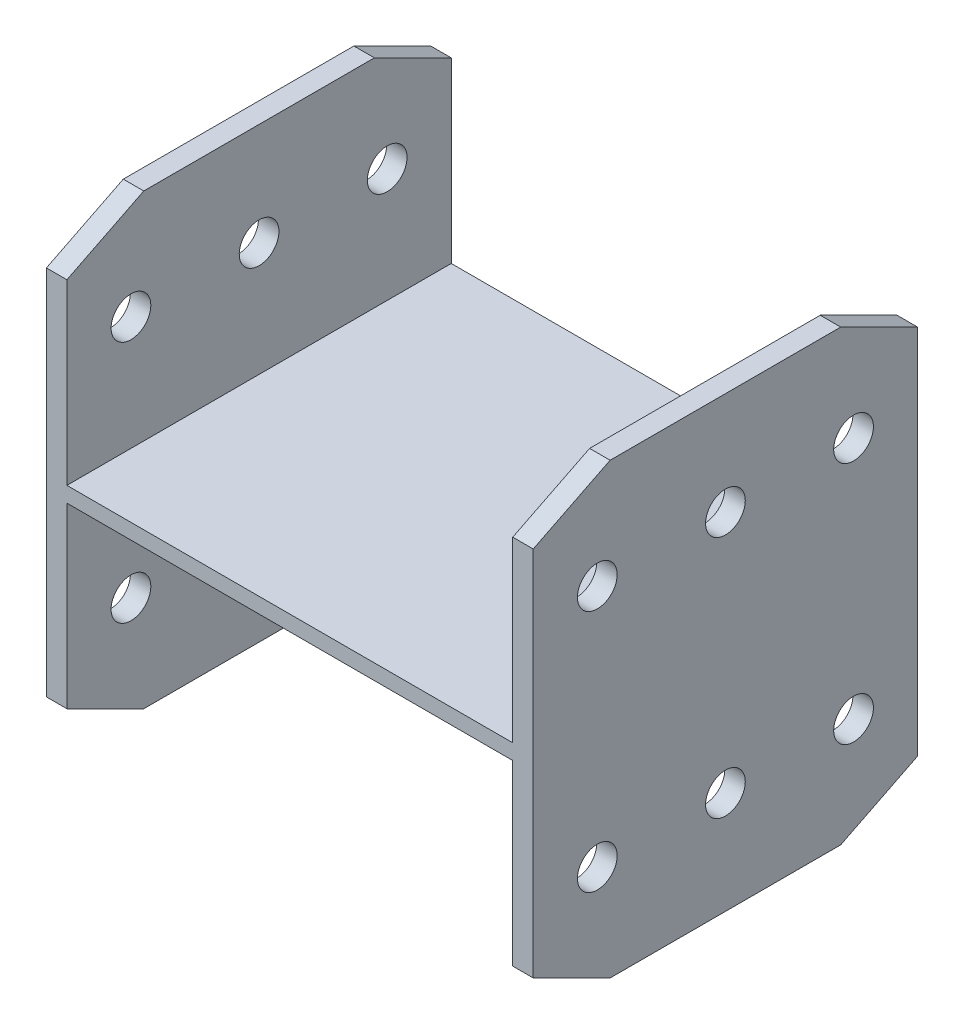
ISO-10303-21;
HEADER;
FILE_DESCRIPTION(('STEP AP214'),'2;1');
FILE_NAME('part.step','',(''),(''),'','','');
FILE_SCHEMA(('AUTOMOTIVE_DESIGN { 1 0 10303 214 1 1 1 1 }'));
ENDSEC;
DATA;
#1=APPLICATION_CONTEXT('core data for automotive mechanical design processes');
#2=APPLICATION_PROTOCOL_DEFINITION('international standard','automotive_design',2000,#1);
#3=PRODUCT_CONTEXT('',#1,'mechanical');
#4=PRODUCT('Part','Part','',(#3));
#5=PRODUCT_RELATED_PRODUCT_CATEGORY('part','',(#4));
#6=PRODUCT_DEFINITION_FORMATION('','',#4);
#7=PRODUCT_DEFINITION_CONTEXT('part definition',#1,'design');
#8=PRODUCT_DEFINITION('design','',#6,#7);
#9=PRODUCT_DEFINITION_SHAPE('','',#8);
#10=(LENGTH_UNIT() NAMED_UNIT(*) SI_UNIT(.MILLI.,.METRE.));
#11=(NAMED_UNIT(*) PLANE_ANGLE_UNIT() SI_UNIT($,.RADIAN.));
#12=(NAMED_UNIT(*) SI_UNIT($,.STERADIAN.) SOLID_ANGLE_UNIT());
#13=UNCERTAINTY_MEASURE_WITH_UNIT(LENGTH_MEASURE(1.E-05),#10,'distance_accuracy_value','');
#14=(GEOMETRIC_REPRESENTATION_CONTEXT(3) GLOBAL_UNCERTAINTY_ASSIGNED_CONTEXT((#13)) GLOBAL_UNIT_ASSIGNED_CONTEXT((#10,
#11,#12)) REPRESENTATION_CONTEXT('',''));
#15=CARTESIAN_POINT('',(0.,0.,0.));
#16=DIRECTION('',(0.,0.,1.));
#17=DIRECTION('',(1.,0.,0.));
#18=AXIS2_PLACEMENT_3D('',#15,#16,#17);
#19=CARTESIAN_POINT('',(-174.,-5.99999999999997,150.));
#20=DIRECTION('',(-1.,0.,0.));
#21=DIRECTION('',(0.,-1.,0.));
#22=AXIS2_PLACEMENT_3D('',#19,#20,#21);
#23=PLANE('',#22);
#24=CARTESIAN_POINT('',(-174.,-95.,100.));
#25=DIRECTION('',(-1.,0.,0.));
#26=DIRECTION('',(0.,-1.,0.));
#27=AXIS2_PLACEMENT_3D('',#24,#25,#26);
#28=CIRCLE('',#27,15.5);
#29=CARTESIAN_POINT('',(-174.,-110.5,100.));
#30=VERTEX_POINT('',#29);
#31=EDGE_CURVE('E313',#30,#30,#28,.T.);
#32=ORIENTED_EDGE('',*,*,#31,.T.);
#33=EDGE_LOOP('',(#32));
#34=FACE_BOUND('',#33,.T.);
#35=CARTESIAN_POINT('',(-174.,-95.,0.));
#36=DIRECTION('',(-1.,0.,0.));
#37=DIRECTION('',(0.,-1.,0.));
#38=AXIS2_PLACEMENT_3D('',#35,#36,#37);
#39=CIRCLE('',#38,15.5);
#40=CARTESIAN_POINT('',(-174.,-110.5,0.));
#41=VERTEX_POINT('',#40);
#42=EDGE_CURVE('E325',#41,#41,#39,.T.);
#43=ORIENTED_EDGE('',*,*,#42,.T.);
#44=EDGE_LOOP('',(#43));
#45=FACE_BOUND('',#44,.T.);
#46=CARTESIAN_POINT('',(-174.,-95.,-100.));
#47=DIRECTION('',(-1.,0.,0.));
#48=DIRECTION('',(0.,-1.,0.));
#49=AXIS2_PLACEMENT_3D('',#46,#47,#48);
#50=CIRCLE('',#49,15.5);
#51=CARTESIAN_POINT('',(-174.,-110.5,-100.));
#52=VERTEX_POINT('',#51);
#53=EDGE_CURVE('E361',#52,#52,#50,.T.);
#54=ORIENTED_EDGE('',*,*,#53,.T.);
#55=EDGE_LOOP('',(#54));
#56=FACE_BOUND('',#55,.T.);
#57=DIRECTION('',(0.,1.,0.));
#58=VECTOR('',#57,1.);
#59=CARTESIAN_POINT('',(-174.,-5.99999999999997,150.));
#60=LINE('',#59,#58);
#61=CARTESIAN_POINT('',(-174.,-145.,150.));
#62=VERTEX_POINT('',#61);
#63=CARTESIAN_POINT('',(-174.,-5.99999999999997,150.));
#64=VERTEX_POINT('',#63);
#65=EDGE_CURVE('E243',#62,#64,#60,.T.);
#66=ORIENTED_EDGE('',*,*,#65,.F.);
#67=DIRECTION('',(0.,-0.447213595499958,-0.894427190999916));
#68=VECTOR('',#67,1.);
#69=CARTESIAN_POINT('',(-174.,-117.2,205.6));
#70=LINE('',#69,#68);
#71=CARTESIAN_POINT('',(-174.,-175.,90.));
#72=VERTEX_POINT('',#71);
#73=EDGE_CURVE('E46',#62,#72,#70,.T.);
#74=ORIENTED_EDGE('',*,*,#73,.T.);
#75=DIRECTION('',(0.,0.,-1.));
#76=VECTOR('',#75,1.);
#77=CARTESIAN_POINT('',(-174.,-175.,150.));
#78=LINE('',#77,#76);
#79=CARTESIAN_POINT('',(-174.,-175.,-90.));
#80=VERTEX_POINT('',#79);
#81=EDGE_CURVE('E244',#72,#80,#78,.T.);
#82=ORIENTED_EDGE('',*,*,#81,.T.);
#83=DIRECTION('',(0.,0.447213595499958,-0.894427190999916));
#84=VECTOR('',#83,1.);
#85=CARTESIAN_POINT('',(-174.,-237.2,34.4));
#86=LINE('',#85,#84);
#87=CARTESIAN_POINT('',(-174.,-145.,-150.));
#88=VERTEX_POINT('',#87);
#89=EDGE_CURVE('E409',#80,#88,#86,.T.);
#90=ORIENTED_EDGE('',*,*,#89,.T.);
#91=DIRECTION('',(0.,1.,0.));
#92=VECTOR('',#91,1.);
#93=CARTESIAN_POINT('',(-174.,-5.99999999999997,-150.));
#94=LINE('',#93,#92);
#95=CARTESIAN_POINT('',(-174.,-5.99999999999997,-150.));
#96=VERTEX_POINT('',#95);
#97=EDGE_CURVE('E376',#88,#96,#94,.T.);
#98=ORIENTED_EDGE('',*,*,#97,.T.);
#99=DIRECTION('',(0.,0.,-1.));
#100=VECTOR('',#99,1.);
#101=CARTESIAN_POINT('',(-174.,-5.99999999999997,150.));
#102=LINE('',#101,#100);
#103=EDGE_CURVE('E201',#64,#96,#102,.T.);
#104=ORIENTED_EDGE('',*,*,#103,.F.);
#105=EDGE_LOOP('',(#66,#74,#82,#90,#98,#104));
#106=FACE_BOUND('',#105,.T.);
#107=ADVANCED_FACE('F32',(#34,#45,#56,#106),#23,.F.);
#108=CARTESIAN_POINT('',(-174.,-5.99999999999997,150.));
#109=DIRECTION('',(0.,1.,0.));
#110=DIRECTION('',(0.,0.,1.));
#111=AXIS2_PLACEMENT_3D('',#108,#109,#110);
#112=PLANE('',#111);
#113=DIRECTION('',(1.,0.,0.));
#114=VECTOR('',#113,1.);
#115=CARTESIAN_POINT('',(-174.,-5.99999999999997,-150.));
#116=LINE('',#115,#114);
#117=CARTESIAN_POINT('',(174.,-5.99999999999997,-150.));
#118=VERTEX_POINT('',#117);
#119=EDGE_CURVE('E232',#96,#118,#116,.T.);
#120=ORIENTED_EDGE('',*,*,#119,.T.);
#121=DIRECTION('',(0.,0.,-1.));
#122=VECTOR('',#121,1.);
#123=CARTESIAN_POINT('',(174.,-5.99999999999997,150.));
#124=LINE('',#123,#122);
#125=CARTESIAN_POINT('',(174.,-5.99999999999997,150.));
#126=VERTEX_POINT('',#125);
#127=EDGE_CURVE('E192',#126,#118,#124,.T.);
#128=ORIENTED_EDGE('',*,*,#127,.F.);
#129=DIRECTION('',(1.,0.,0.));
#130=VECTOR('',#129,1.);
#131=CARTESIAN_POINT('',(-174.,-5.99999999999997,150.));
#132=LINE('',#131,#130);
#133=EDGE_CURVE('E378',#64,#126,#132,.T.);
#134=ORIENTED_EDGE('',*,*,#133,.F.);
#135=ORIENTED_EDGE('',*,*,#103,.T.);
#136=EDGE_LOOP('',(#120,#128,#134,#135));
#137=FACE_BOUND('',#136,.T.);
#138=ADVANCED_FACE('F396',(#137),#112,.F.);
#139=CARTESIAN_POINT('',(174.,-175.,150.));
#140=DIRECTION('',(1.,0.,0.));
#141=DIRECTION('',(0.,0.,-1.));
#142=AXIS2_PLACEMENT_3D('',#139,#140,#141);
#143=PLANE('',#142);
#144=CARTESIAN_POINT('',(174.,-95.,100.));
#145=DIRECTION('',(1.,0.,0.));
#146=DIRECTION('',(0.,0.,-1.));
#147=AXIS2_PLACEMENT_3D('',#144,#145,#146);
#148=CIRCLE('',#147,15.5);
#149=CARTESIAN_POINT('',(174.,-95.,84.5));
#150=VERTEX_POINT('',#149);
#151=EDGE_CURVE('E308',#150,#150,#148,.T.);
#152=ORIENTED_EDGE('',*,*,#151,.T.);
#153=EDGE_LOOP('',(#152));
#154=FACE_BOUND('',#153,.T.);
#155=CARTESIAN_POINT('',(174.,-95.,0.));
#156=DIRECTION('',(1.,0.,0.));
#157=DIRECTION('',(0.,0.,-1.));
#158=AXIS2_PLACEMENT_3D('',#155,#156,#157);
#159=CIRCLE('',#158,15.5);
#160=CARTESIAN_POINT('',(174.,-95.,-15.5));
#161=VERTEX_POINT('',#160);
#162=EDGE_CURVE('E320',#161,#161,#159,.T.);
#163=ORIENTED_EDGE('',*,*,#162,.T.);
#164=EDGE_LOOP('',(#163));
#165=FACE_BOUND('',#164,.T.);
#166=CARTESIAN_POINT('',(174.,-95.,-100.));
#167=DIRECTION('',(1.,0.,0.));
#168=DIRECTION('',(0.,0.,-1.));
#169=AXIS2_PLACEMENT_3D('',#166,#167,#168);
#170=CIRCLE('',#169,15.5);
#171=CARTESIAN_POINT('',(174.,-95.,-115.5));
#172=VERTEX_POINT('',#171);
#173=EDGE_CURVE('E356',#172,#172,#170,.T.);
#174=ORIENTED_EDGE('',*,*,#173,.T.);
#175=EDGE_LOOP('',(#174));
#176=FACE_BOUND('',#175,.T.);
#177=DIRECTION('',(0.,0.,-1.));
#178=VECTOR('',#177,1.);
#179=CARTESIAN_POINT('',(174.,-175.,150.));
#180=LINE('',#179,#178);
#181=CARTESIAN_POINT('',(174.,-175.,90.));
#182=VERTEX_POINT('',#181);
#183=CARTESIAN_POINT('',(174.,-175.,-90.));
#184=VERTEX_POINT('',#183);
#185=EDGE_CURVE('E189',#182,#184,#180,.T.);
#186=ORIENTED_EDGE('',*,*,#185,.F.);
#187=DIRECTION('',(0.,0.447213595499958,0.894427190999916));
#188=VECTOR('',#187,1.);
#189=CARTESIAN_POINT('',(174.,-151.,138.));
#190=LINE('',#189,#188);
#191=CARTESIAN_POINT('',(174.,-145.,150.));
#192=VERTEX_POINT('',#191);
#193=EDGE_CURVE('E168',#182,#192,#190,.T.);
#194=ORIENTED_EDGE('',*,*,#193,.T.);
#195=DIRECTION('',(0.,-1.,0.));
#196=VECTOR('',#195,1.);
#197=CARTESIAN_POINT('',(174.,-175.,150.));
#198=LINE('',#197,#196);
#199=EDGE_CURVE('E380',#126,#192,#198,.T.);
#200=ORIENTED_EDGE('',*,*,#199,.F.);
#201=ORIENTED_EDGE('',*,*,#127,.T.);
#202=DIRECTION('',(0.,-1.,0.));
#203=VECTOR('',#202,1.);
#204=CARTESIAN_POINT('',(174.,-175.,-150.));
#205=LINE('',#204,#203);
#206=CARTESIAN_POINT('',(174.,-145.,-150.));
#207=VERTEX_POINT('',#206);
#208=EDGE_CURVE('E228',#118,#207,#205,.T.);
#209=ORIENTED_EDGE('',*,*,#208,.T.);
#210=DIRECTION('',(0.,-0.447213595499958,0.894427190999916));
#211=VECTOR('',#210,1.);
#212=CARTESIAN_POINT('',(174.,-271.,102.));
#213=LINE('',#212,#211);
#214=EDGE_CURVE('E213',#207,#184,#213,.T.);
#215=ORIENTED_EDGE('',*,*,#214,.T.);
#216=EDGE_LOOP('',(#186,#194,#200,#201,#209,#215));
#217=FACE_BOUND('',#216,.T.);
#218=ADVANCED_FACE('F402',(#154,#165,#176,#217),#143,.F.);
#219=CARTESIAN_POINT('',(190.,-175.,150.));
#220=DIRECTION('',(0.,1.,0.));
#221=DIRECTION('',(0.,0.,1.));
#222=AXIS2_PLACEMENT_3D('',#219,#220,#221);
#223=PLANE('',#222);
#224=DIRECTION('',(0.,0.,-1.));
#225=VECTOR('',#224,1.);
#226=CARTESIAN_POINT('',(190.,-175.,150.));
#227=LINE('',#226,#225);
#228=CARTESIAN_POINT('',(190.,-175.,90.));
#229=VERTEX_POINT('',#228);
#230=CARTESIAN_POINT('',(190.,-175.,-90.));
#231=VERTEX_POINT('',#230);
#232=EDGE_CURVE('E179',#229,#231,#227,.T.);
#233=ORIENTED_EDGE('',*,*,#232,.F.);
#234=DIRECTION('',(1.,0.,0.));
#235=VECTOR('',#234,1.);
#236=CARTESIAN_POINT('',(-190.,-175.,90.));
#237=LINE('',#236,#235);
#238=EDGE_CURVE('E165',#182,#229,#237,.T.);
#239=ORIENTED_EDGE('',*,*,#238,.F.);
#240=ORIENTED_EDGE('',*,*,#185,.T.);
#241=DIRECTION('',(1.,0.,0.));
#242=VECTOR('',#241,1.);
#243=CARTESIAN_POINT('',(-190.,-175.,-90.));
#244=LINE('',#243,#242);
#245=EDGE_CURVE('E188',#184,#231,#244,.T.);
#246=ORIENTED_EDGE('',*,*,#245,.T.);
#247=EDGE_LOOP('',(#233,#239,#240,#246));
#248=FACE_BOUND('',#247,.T.);
#249=ADVANCED_FACE('F186',(#248),#223,.F.);
#250=CARTESIAN_POINT('',(190.,175.,150.));
#251=DIRECTION('',(-1.,0.,0.));
#252=DIRECTION('',(0.,0.,1.));
#253=AXIS2_PLACEMENT_3D('',#250,#251,#252);
#254=PLANE('',#253);
#255=CARTESIAN_POINT('',(190.,-95.,100.));
#256=DIRECTION('',(1.,0.,0.));
#257=DIRECTION('',(0.,0.,1.));
#258=AXIS2_PLACEMENT_3D('',#255,#256,#257);
#259=CIRCLE('',#258,15.5);
#260=CARTESIAN_POINT('',(190.,-95.,115.5));
#261=VERTEX_POINT('',#260);
#262=EDGE_CURVE('E304',#261,#261,#259,.T.);
#263=ORIENTED_EDGE('',*,*,#262,.F.);
#264=EDGE_LOOP('',(#263));
#265=FACE_BOUND('',#264,.T.);
#266=CARTESIAN_POINT('',(190.,-95.,0.));
#267=DIRECTION('',(1.,0.,0.));
#268=DIRECTION('',(0.,0.,1.));
#269=AXIS2_PLACEMENT_3D('',#266,#267,#268);
#270=CIRCLE('',#269,15.5);
#271=CARTESIAN_POINT('',(190.,-95.,15.5));
#272=VERTEX_POINT('',#271);
#273=EDGE_CURVE('E316',#272,#272,#270,.T.);
#274=ORIENTED_EDGE('',*,*,#273,.F.);
#275=EDGE_LOOP('',(#274));
#276=FACE_BOUND('',#275,.T.);
#277=CARTESIAN_POINT('',(190.,95.,-100.));
#278=DIRECTION('',(1.,0.,0.));
#279=DIRECTION('',(0.,0.,-1.));
#280=AXIS2_PLACEMENT_3D('',#277,#278,#279);
#281=CIRCLE('',#280,15.5);
#282=CARTESIAN_POINT('',(190.,95.,-115.5));
#283=VERTEX_POINT('',#282);
#284=EDGE_CURVE('E328',#283,#283,#281,.T.);
#285=ORIENTED_EDGE('',*,*,#284,.F.);
#286=EDGE_LOOP('',(#285));
#287=FACE_BOUND('',#286,.T.);
#288=CARTESIAN_POINT('',(190.,95.,0.));
#289=DIRECTION('',(1.,0.,0.));
#290=DIRECTION('',(0.,0.,-1.));
#291=AXIS2_PLACEMENT_3D('',#288,#289,#290);
#292=CIRCLE('',#291,15.5);
#293=CARTESIAN_POINT('',(190.,95.,-15.5));
#294=VERTEX_POINT('',#293);
#295=EDGE_CURVE('E340',#294,#294,#292,.T.);
#296=ORIENTED_EDGE('',*,*,#295,.F.);
#297=EDGE_LOOP('',(#296));
#298=FACE_BOUND('',#297,.T.);
#299=CARTESIAN_POINT('',(190.,-95.,-100.));
#300=DIRECTION('',(1.,0.,0.));
#301=DIRECTION('',(0.,0.,1.));
#302=AXIS2_PLACEMENT_3D('',#299,#300,#301);
#303=CIRCLE('',#302,15.5);
#304=CARTESIAN_POINT('',(190.,-95.,-84.5));
#305=VERTEX_POINT('',#304);
#306=EDGE_CURVE('E352',#305,#305,#303,.T.);
#307=ORIENTED_EDGE('',*,*,#306,.F.);
#308=EDGE_LOOP('',(#307));
#309=FACE_BOUND('',#308,.T.);
#310=CARTESIAN_POINT('',(190.,95.,100.));
#311=DIRECTION('',(1.,0.,0.));
#312=DIRECTION('',(0.,0.,-1.));
#313=AXIS2_PLACEMENT_3D('',#310,#311,#312);
#314=CIRCLE('',#313,15.5);
#315=CARTESIAN_POINT('',(190.,95.,84.5));
#316=VERTEX_POINT('',#315);
#317=EDGE_CURVE('E364',#316,#316,#314,.T.);
#318=ORIENTED_EDGE('',*,*,#317,.F.);
#319=EDGE_LOOP('',(#318));
#320=FACE_BOUND('',#319,.T.);
#321=DIRECTION('',(0.,1.,0.));
#322=VECTOR('',#321,1.);
#323=CARTESIAN_POINT('',(190.,175.,150.));
#324=LINE('',#323,#322);
#325=CARTESIAN_POINT('',(190.,-145.,150.));
#326=VERTEX_POINT('',#325);
#327=CARTESIAN_POINT('',(190.,145.,150.));
#328=VERTEX_POINT('',#327);
#329=EDGE_CURVE('E182',#326,#328,#324,.T.);
#330=ORIENTED_EDGE('',*,*,#329,.F.);
#331=DIRECTION('',(0.,0.447213595499958,0.894427190999916));
#332=VECTOR('',#331,1.);
#333=CARTESIAN_POINT('',(190.,-175.,90.));
#334=LINE('',#333,#332);
#335=EDGE_CURVE('E54',#229,#326,#334,.T.);
#336=ORIENTED_EDGE('',*,*,#335,.F.);
#337=ORIENTED_EDGE('',*,*,#232,.T.);
#338=DIRECTION('',(0.,-0.447213595499958,0.894427190999916));
#339=VECTOR('',#338,1.);
#340=CARTESIAN_POINT('',(190.,-175.,-90.));
#341=LINE('',#340,#339);
#342=CARTESIAN_POINT('',(190.,-145.,-150.));
#343=VERTEX_POINT('',#342);
#344=EDGE_CURVE('E211',#343,#231,#341,.T.);
#345=ORIENTED_EDGE('',*,*,#344,.F.);
#346=DIRECTION('',(0.,1.,0.));
#347=VECTOR('',#346,1.);
#348=CARTESIAN_POINT('',(190.,175.,-150.));
#349=LINE('',#348,#347);
#350=CARTESIAN_POINT('',(190.,145.,-150.));
#351=VERTEX_POINT('',#350);
#352=EDGE_CURVE('E219',#343,#351,#349,.T.);
#353=ORIENTED_EDGE('',*,*,#352,.T.);
#354=DIRECTION('',(0.,-0.447213595499958,-0.894427190999916));
#355=VECTOR('',#354,1.);
#356=CARTESIAN_POINT('',(190.,175.,-90.));
#357=LINE('',#356,#355);
#358=CARTESIAN_POINT('',(190.,175.,-90.));
#359=VERTEX_POINT('',#358);
#360=EDGE_CURVE('E422',#359,#351,#357,.T.);
#361=ORIENTED_EDGE('',*,*,#360,.F.);
#362=DIRECTION('',(0.,0.,-1.));
#363=VECTOR('',#362,1.);
#364=CARTESIAN_POINT('',(190.,175.,150.));
#365=LINE('',#364,#363);
#366=CARTESIAN_POINT('',(190.,175.,90.));
#367=VERTEX_POINT('',#366);
#368=EDGE_CURVE('E190',#367,#359,#365,.T.);
#369=ORIENTED_EDGE('',*,*,#368,.F.);
#370=DIRECTION('',(0.,0.447213595499958,-0.894427190999916));
#371=VECTOR('',#370,1.);
#372=CARTESIAN_POINT('',(190.,175.,90.));
#373=LINE('',#372,#371);
#374=EDGE_CURVE('E290',#328,#367,#373,.T.);
#375=ORIENTED_EDGE('',*,*,#374,.F.);
#376=EDGE_LOOP('',(#330,#336,#337,#345,#353,#361,#369,#375));
#377=FACE_BOUND('',#376,.T.);
#378=ADVANCED_FACE('F177',(#265,#276,#287,#298,#309,#320,#377),#254,.F.);
#379=CARTESIAN_POINT('',(174.,175.,150.));
#380=DIRECTION('',(0.,-1.,0.));
#381=DIRECTION('',(0.,0.,-1.));
#382=AXIS2_PLACEMENT_3D('',#379,#380,#381);
#383=PLANE('',#382);
#384=ORIENTED_EDGE('',*,*,#368,.T.);
#385=DIRECTION('',(1.,0.,0.));
#386=VECTOR('',#385,1.);
#387=CARTESIAN_POINT('',(-190.,175.,-90.));
#388=LINE('',#387,#386);
#389=CARTESIAN_POINT('',(174.,175.,-90.));
#390=VERTEX_POINT('',#389);
#391=EDGE_CURVE('E275',#390,#359,#388,.T.);
#392=ORIENTED_EDGE('',*,*,#391,.F.);
#393=DIRECTION('',(0.,0.,-1.));
#394=VECTOR('',#393,1.);
#395=CARTESIAN_POINT('',(174.,175.,150.));
#396=LINE('',#395,#394);
#397=CARTESIAN_POINT('',(174.,175.,90.));
#398=VERTEX_POINT('',#397);
#399=EDGE_CURVE('E195',#398,#390,#396,.T.);
#400=ORIENTED_EDGE('',*,*,#399,.F.);
#401=DIRECTION('',(1.,0.,0.));
#402=VECTOR('',#401,1.);
#403=CARTESIAN_POINT('',(-190.,175.,90.));
#404=LINE('',#403,#402);
#405=EDGE_CURVE('E273',#398,#367,#404,.T.);
#406=ORIENTED_EDGE('',*,*,#405,.T.);
#407=EDGE_LOOP('',(#384,#392,#400,#406));
#408=FACE_BOUND('',#407,.T.);
#409=ADVANCED_FACE('F272',(#408),#383,.F.);
#410=CARTESIAN_POINT('',(174.,5.99999999999997,150.));
#411=DIRECTION('',(1.,0.,0.));
#412=DIRECTION('',(0.,1.,0.));
#413=AXIS2_PLACEMENT_3D('',#410,#411,#412);
#414=PLANE('',#413);
#415=CARTESIAN_POINT('',(174.,95.,-100.));
#416=DIRECTION('',(1.,0.,0.));
#417=DIRECTION('',(0.,1.,0.));
#418=AXIS2_PLACEMENT_3D('',#415,#416,#417);
#419=CIRCLE('',#418,15.5);
#420=CARTESIAN_POINT('',(174.,110.5,-100.));
#421=VERTEX_POINT('',#420);
#422=EDGE_CURVE('E337',#421,#421,#419,.T.);
#423=ORIENTED_EDGE('',*,*,#422,.T.);
#424=EDGE_LOOP('',(#423));
#425=FACE_BOUND('',#424,.T.);
#426=CARTESIAN_POINT('',(174.,95.,0.));
#427=DIRECTION('',(1.,0.,0.));
#428=DIRECTION('',(0.,1.,0.));
#429=AXIS2_PLACEMENT_3D('',#426,#427,#428);
#430=CIRCLE('',#429,15.5);
#431=CARTESIAN_POINT('',(174.,110.5,0.));
#432=VERTEX_POINT('',#431);
#433=EDGE_CURVE('E349',#432,#432,#430,.T.);
#434=ORIENTED_EDGE('',*,*,#433,.T.);
#435=EDGE_LOOP('',(#434));
#436=FACE_BOUND('',#435,.T.);
#437=CARTESIAN_POINT('',(174.,95.,100.));
#438=DIRECTION('',(1.,0.,0.));
#439=DIRECTION('',(0.,1.,0.));
#440=AXIS2_PLACEMENT_3D('',#437,#438,#439);
#441=CIRCLE('',#440,15.5);
#442=CARTESIAN_POINT('',(174.,110.5,100.));
#443=VERTEX_POINT('',#442);
#444=EDGE_CURVE('E373',#443,#443,#441,.T.);
#445=ORIENTED_EDGE('',*,*,#444,.T.);
#446=EDGE_LOOP('',(#445));
#447=FACE_BOUND('',#446,.T.);
#448=ORIENTED_EDGE('',*,*,#399,.T.);
#449=DIRECTION('',(0.,-0.447213595499958,-0.894427190999916));
#450=VECTOR('',#449,1.);
#451=CARTESIAN_POINT('',(174.,237.2,34.4));
#452=LINE('',#451,#450);
#453=CARTESIAN_POINT('',(174.,145.,-150.));
#454=VERTEX_POINT('',#453);
#455=EDGE_CURVE('E266',#390,#454,#452,.T.);
#456=ORIENTED_EDGE('',*,*,#455,.T.);
#457=DIRECTION('',(0.,-1.,0.));
#458=VECTOR('',#457,1.);
#459=CARTESIAN_POINT('',(174.,5.99999999999997,-150.));
#460=LINE('',#459,#458);
#461=CARTESIAN_POINT('',(174.,5.99999999999997,-150.));
#462=VERTEX_POINT('',#461);
#463=EDGE_CURVE('E227',#454,#462,#460,.T.);
#464=ORIENTED_EDGE('',*,*,#463,.T.);
#465=DIRECTION('',(0.,0.,-1.));
#466=VECTOR('',#465,1.);
#467=CARTESIAN_POINT('',(174.,5.99999999999997,150.));
#468=LINE('',#467,#466);
#469=CARTESIAN_POINT('',(174.,5.99999999999997,150.));
#470=VERTEX_POINT('',#469);
#471=EDGE_CURVE('E258',#470,#462,#468,.T.);
#472=ORIENTED_EDGE('',*,*,#471,.F.);
#473=DIRECTION('',(0.,-1.,0.));
#474=VECTOR('',#473,1.);
#475=CARTESIAN_POINT('',(174.,5.99999999999997,150.));
#476=LINE('',#475,#474);
#477=CARTESIAN_POINT('',(174.,145.,150.));
#478=VERTEX_POINT('',#477);
#479=EDGE_CURVE('E384',#478,#470,#476,.T.);
#480=ORIENTED_EDGE('',*,*,#479,.F.);
#481=DIRECTION('',(0.,0.447213595499958,-0.894427190999916));
#482=VECTOR('',#481,1.);
#483=CARTESIAN_POINT('',(174.,117.2,205.6));
#484=LINE('',#483,#482);
#485=EDGE_CURVE('E268',#478,#398,#484,.T.);
#486=ORIENTED_EDGE('',*,*,#485,.T.);
#487=EDGE_LOOP('',(#448,#456,#464,#472,#480,#486));
#488=FACE_BOUND('',#487,.T.);
#489=ADVANCED_FACE('F265',(#425,#436,#447,#488),#414,.F.);
#490=CARTESIAN_POINT('',(174.,5.99999999999997,150.));
#491=DIRECTION('',(0.,-1.,0.));
#492=DIRECTION('',(0.,0.,-1.));
#493=AXIS2_PLACEMENT_3D('',#490,#491,#492);
#494=PLANE('',#493);
#495=DIRECTION('',(-1.,0.,0.));
#496=VECTOR('',#495,1.);
#497=CARTESIAN_POINT('',(174.,5.99999999999997,-150.));
#498=LINE('',#497,#496);
#499=CARTESIAN_POINT('',(-174.,5.99999999999997,-150.));
#500=VERTEX_POINT('',#499);
#501=EDGE_CURVE('E230',#462,#500,#498,.T.);
#502=ORIENTED_EDGE('',*,*,#501,.T.);
#503=DIRECTION('',(0.,0.,-1.));
#504=VECTOR('',#503,1.);
#505=CARTESIAN_POINT('',(-174.,5.99999999999997,150.));
#506=LINE('',#505,#504);
#507=CARTESIAN_POINT('',(-174.,5.99999999999997,150.));
#508=VERTEX_POINT('',#507);
#509=EDGE_CURVE('E255',#508,#500,#506,.T.);
#510=ORIENTED_EDGE('',*,*,#509,.F.);
#511=DIRECTION('',(-1.,0.,0.));
#512=VECTOR('',#511,1.);
#513=CARTESIAN_POINT('',(174.,5.99999999999997,150.));
#514=LINE('',#513,#512);
#515=EDGE_CURVE('E386',#470,#508,#514,.T.);
#516=ORIENTED_EDGE('',*,*,#515,.F.);
#517=ORIENTED_EDGE('',*,*,#471,.T.);
#518=EDGE_LOOP('',(#502,#510,#516,#517));
#519=FACE_BOUND('',#518,.T.);
#520=ADVANCED_FACE('F451',(#519),#494,.F.);
#521=CARTESIAN_POINT('',(-174.,175.,150.));
#522=DIRECTION('',(-1.,0.,0.));
#523=DIRECTION('',(0.,-1.,0.));
#524=AXIS2_PLACEMENT_3D('',#521,#522,#523);
#525=PLANE('',#524);
#526=CARTESIAN_POINT('',(-174.,95.,-100.));
#527=DIRECTION('',(-1.,0.,0.));
#528=DIRECTION('',(0.,-1.,0.));
#529=AXIS2_PLACEMENT_3D('',#526,#527,#528);
#530=CIRCLE('',#529,15.5);
#531=CARTESIAN_POINT('',(-174.,79.5,-100.));
#532=VERTEX_POINT('',#531);
#533=EDGE_CURVE('E332',#532,#532,#530,.T.);
#534=ORIENTED_EDGE('',*,*,#533,.T.);
#535=EDGE_LOOP('',(#534));
#536=FACE_BOUND('',#535,.T.);
#537=CARTESIAN_POINT('',(-174.,95.,0.));
#538=DIRECTION('',(-1.,0.,0.));
#539=DIRECTION('',(0.,-1.,0.));
#540=AXIS2_PLACEMENT_3D('',#537,#538,#539);
#541=CIRCLE('',#540,15.5);
#542=CARTESIAN_POINT('',(-174.,79.5,0.));
#543=VERTEX_POINT('',#542);
#544=EDGE_CURVE('E344',#543,#543,#541,.T.);
#545=ORIENTED_EDGE('',*,*,#544,.T.);
#546=EDGE_LOOP('',(#545));
#547=FACE_BOUND('',#546,.T.);
#548=CARTESIAN_POINT('',(-174.,95.,100.));
#549=DIRECTION('',(-1.,0.,0.));
#550=DIRECTION('',(0.,-1.,0.));
#551=AXIS2_PLACEMENT_3D('',#548,#549,#550);
#552=CIRCLE('',#551,15.5);
#553=CARTESIAN_POINT('',(-174.,79.5,100.));
#554=VERTEX_POINT('',#553);
#555=EDGE_CURVE('E368',#554,#554,#552,.T.);
#556=ORIENTED_EDGE('',*,*,#555,.T.);
#557=EDGE_LOOP('',(#556));
#558=FACE_BOUND('',#557,.T.);
#559=DIRECTION('',(0.,1.,0.));
#560=VECTOR('',#559,1.);
#561=CARTESIAN_POINT('',(-174.,175.,-150.));
#562=LINE('',#561,#560);
#563=CARTESIAN_POINT('',(-174.,145.,-150.));
#564=VERTEX_POINT('',#563);
#565=EDGE_CURVE('E237',#500,#564,#562,.T.);
#566=ORIENTED_EDGE('',*,*,#565,.T.);
#567=DIRECTION('',(0.,0.447213595499958,0.894427190999916));
#568=VECTOR('',#567,1.);
#569=CARTESIAN_POINT('',(-174.,271.,102.));
#570=LINE('',#569,#568);
#571=CARTESIAN_POINT('',(-174.,175.,-90.));
#572=VERTEX_POINT('',#571);
#573=EDGE_CURVE('E280',#564,#572,#570,.T.);
#574=ORIENTED_EDGE('',*,*,#573,.T.);
#575=DIRECTION('',(0.,0.,-1.));
#576=VECTOR('',#575,1.);
#577=CARTESIAN_POINT('',(-174.,175.,150.));
#578=LINE('',#577,#576);
#579=CARTESIAN_POINT('',(-174.,175.,90.));
#580=VERTEX_POINT('',#579);
#581=EDGE_CURVE('E252',#580,#572,#578,.T.);
#582=ORIENTED_EDGE('',*,*,#581,.F.);
#583=DIRECTION('',(0.,-0.447213595499958,0.894427190999916));
#584=VECTOR('',#583,1.);
#585=CARTESIAN_POINT('',(-174.,151.,138.));
#586=LINE('',#585,#584);
#587=CARTESIAN_POINT('',(-174.,145.,150.));
#588=VERTEX_POINT('',#587);
#589=EDGE_CURVE('E299',#580,#588,#586,.T.);
#590=ORIENTED_EDGE('',*,*,#589,.T.);
#591=DIRECTION('',(0.,1.,0.));
#592=VECTOR('',#591,1.);
#593=CARTESIAN_POINT('',(-174.,175.,150.));
#594=LINE('',#593,#592);
#595=EDGE_CURVE('E388',#508,#588,#594,.T.);
#596=ORIENTED_EDGE('',*,*,#595,.F.);
#597=ORIENTED_EDGE('',*,*,#509,.T.);
#598=EDGE_LOOP('',(#566,#574,#582,#590,#596,#597));
#599=FACE_BOUND('',#598,.T.);
#600=ADVANCED_FACE('F442',(#536,#547,#558,#599),#525,.F.);
#601=CARTESIAN_POINT('',(-190.,175.,150.));
#602=DIRECTION('',(0.,-1.,0.));
#603=DIRECTION('',(0.,0.,-1.));
#604=AXIS2_PLACEMENT_3D('',#601,#602,#603);
#605=PLANE('',#604);
#606=ORIENTED_EDGE('',*,*,#581,.T.);
#607=CARTESIAN_POINT('',(-190.,175.,-90.));
#608=VERTEX_POINT('',#607);
#609=EDGE_CURVE('E277',#608,#572,#388,.T.);
#610=ORIENTED_EDGE('',*,*,#609,.F.);
#611=DIRECTION('',(0.,0.,-1.));
#612=VECTOR('',#611,1.);
#613=CARTESIAN_POINT('',(-190.,175.,150.));
#614=LINE('',#613,#612);
#615=CARTESIAN_POINT('',(-190.,175.,90.));
#616=VERTEX_POINT('',#615);
#617=EDGE_CURVE('E249',#616,#608,#614,.T.);
#618=ORIENTED_EDGE('',*,*,#617,.F.);
#619=EDGE_CURVE('E296',#616,#580,#404,.T.);
#620=ORIENTED_EDGE('',*,*,#619,.T.);
#621=EDGE_LOOP('',(#606,#610,#618,#620));
#622=FACE_BOUND('',#621,.T.);
#623=ADVANCED_FACE('F444',(#622),#605,.F.);
#624=CARTESIAN_POINT('',(-190.,-175.,150.));
#625=DIRECTION('',(1.,0.,0.));
#626=DIRECTION('',(0.,1.,0.));
#627=AXIS2_PLACEMENT_3D('',#624,#625,#626);
#628=PLANE('',#627);
#629=CARTESIAN_POINT('',(-190.,-95.,100.));
#630=DIRECTION('',(1.,0.,0.));
#631=DIRECTION('',(0.,0.,1.));
#632=AXIS2_PLACEMENT_3D('',#629,#630,#631);
#633=CIRCLE('',#632,15.5);
#634=CARTESIAN_POINT('',(-190.,-95.,115.5));
#635=VERTEX_POINT('',#634);
#636=EDGE_CURVE('E305',#635,#635,#633,.T.);
#637=ORIENTED_EDGE('',*,*,#636,.T.);
#638=EDGE_LOOP('',(#637));
#639=FACE_BOUND('',#638,.T.);
#640=CARTESIAN_POINT('',(-190.,-95.,0.));
#641=DIRECTION('',(1.,0.,0.));
#642=DIRECTION('',(0.,0.,1.));
#643=AXIS2_PLACEMENT_3D('',#640,#641,#642);
#644=CIRCLE('',#643,15.5);
#645=CARTESIAN_POINT('',(-190.,-95.,15.5));
#646=VERTEX_POINT('',#645);
#647=EDGE_CURVE('E317',#646,#646,#644,.T.);
#648=ORIENTED_EDGE('',*,*,#647,.T.);
#649=EDGE_LOOP('',(#648));
#650=FACE_BOUND('',#649,.T.);
#651=CARTESIAN_POINT('',(-190.,95.,-100.));
#652=DIRECTION('',(1.,0.,0.));
#653=DIRECTION('',(0.,0.,-1.));
#654=AXIS2_PLACEMENT_3D('',#651,#652,#653);
#655=CIRCLE('',#654,15.5);
#656=CARTESIAN_POINT('',(-190.,95.,-115.5));
#657=VERTEX_POINT('',#656);
#658=EDGE_CURVE('E329',#657,#657,#655,.T.);
#659=ORIENTED_EDGE('',*,*,#658,.T.);
#660=EDGE_LOOP('',(#659));
#661=FACE_BOUND('',#660,.T.);
#662=CARTESIAN_POINT('',(-190.,95.,0.));
#663=DIRECTION('',(1.,0.,0.));
#664=DIRECTION('',(0.,0.,-1.));
#665=AXIS2_PLACEMENT_3D('',#662,#663,#664);
#666=CIRCLE('',#665,15.5);
#667=CARTESIAN_POINT('',(-190.,95.,-15.5));
#668=VERTEX_POINT('',#667);
#669=EDGE_CURVE('E341',#668,#668,#666,.T.);
#670=ORIENTED_EDGE('',*,*,#669,.T.);
#671=EDGE_LOOP('',(#670));
#672=FACE_BOUND('',#671,.T.);
#673=CARTESIAN_POINT('',(-190.,-95.,-100.));
#674=DIRECTION('',(1.,0.,0.));
#675=DIRECTION('',(0.,0.,1.));
#676=AXIS2_PLACEMENT_3D('',#673,#674,#675);
#677=CIRCLE('',#676,15.5);
#678=CARTESIAN_POINT('',(-190.,-95.,-84.5));
#679=VERTEX_POINT('',#678);
#680=EDGE_CURVE('E353',#679,#679,#677,.T.);
#681=ORIENTED_EDGE('',*,*,#680,.T.);
#682=EDGE_LOOP('',(#681));
#683=FACE_BOUND('',#682,.T.);
#684=CARTESIAN_POINT('',(-190.,95.,100.));
#685=DIRECTION('',(1.,0.,0.));
#686=DIRECTION('',(0.,0.,-1.));
#687=AXIS2_PLACEMENT_3D('',#684,#685,#686);
#688=CIRCLE('',#687,15.5);
#689=CARTESIAN_POINT('',(-190.,95.,84.5));
#690=VERTEX_POINT('',#689);
#691=EDGE_CURVE('E365',#690,#690,#688,.T.);
#692=ORIENTED_EDGE('',*,*,#691,.T.);
#693=EDGE_LOOP('',(#692));
#694=FACE_BOUND('',#693,.T.);
#695=DIRECTION('',(0.,0.,-1.));
#696=VECTOR('',#695,1.);
#697=CARTESIAN_POINT('',(-190.,-175.,150.));
#698=LINE('',#697,#696);
#699=CARTESIAN_POINT('',(-190.,-175.,90.));
#700=VERTEX_POINT('',#699);
#701=CARTESIAN_POINT('',(-190.,-175.,-90.));
#702=VERTEX_POINT('',#701);
#703=EDGE_CURVE('E246',#700,#702,#698,.T.);
#704=ORIENTED_EDGE('',*,*,#703,.F.);
#705=DIRECTION('',(0.,0.447213595499958,0.894427190999916));
#706=VECTOR('',#705,1.);
#707=CARTESIAN_POINT('',(-190.,-175.,90.));
#708=LINE('',#707,#706);
#709=CARTESIAN_POINT('',(-190.,-145.,150.));
#710=VERTEX_POINT('',#709);
#711=EDGE_CURVE('E183',#700,#710,#708,.T.);
#712=ORIENTED_EDGE('',*,*,#711,.T.);
#713=DIRECTION('',(0.,-1.,0.));
#714=VECTOR('',#713,1.);
#715=CARTESIAN_POINT('',(-190.,-175.,150.));
#716=LINE('',#715,#714);
#717=CARTESIAN_POINT('',(-190.,145.,150.));
#718=VERTEX_POINT('',#717);
#719=EDGE_CURVE('E247',#718,#710,#716,.T.);
#720=ORIENTED_EDGE('',*,*,#719,.F.);
#721=DIRECTION('',(0.,0.447213595499958,-0.894427190999916));
#722=VECTOR('',#721,1.);
#723=CARTESIAN_POINT('',(-190.,175.,90.));
#724=LINE('',#723,#722);
#725=EDGE_CURVE('E292',#718,#616,#724,.T.);
#726=ORIENTED_EDGE('',*,*,#725,.T.);
#727=ORIENTED_EDGE('',*,*,#617,.T.);
#728=DIRECTION('',(0.,-0.447213595499958,-0.894427190999916));
#729=VECTOR('',#728,1.);
#730=CARTESIAN_POINT('',(-190.,175.,-90.));
#731=LINE('',#730,#729);
#732=CARTESIAN_POINT('',(-190.,145.,-150.));
#733=VERTEX_POINT('',#732);
#734=EDGE_CURVE('E282',#608,#733,#731,.T.);
#735=ORIENTED_EDGE('',*,*,#734,.T.);
#736=DIRECTION('',(0.,-1.,0.));
#737=VECTOR('',#736,1.);
#738=CARTESIAN_POINT('',(-190.,-175.,-150.));
#739=LINE('',#738,#737);
#740=CARTESIAN_POINT('',(-190.,-145.,-150.));
#741=VERTEX_POINT('',#740);
#742=EDGE_CURVE('E240',#733,#741,#739,.T.);
#743=ORIENTED_EDGE('',*,*,#742,.T.);
#744=DIRECTION('',(0.,-0.447213595499958,0.894427190999916));
#745=VECTOR('',#744,1.);
#746=CARTESIAN_POINT('',(-190.,-175.,-90.));
#747=LINE('',#746,#745);
#748=EDGE_CURVE('E221',#741,#702,#747,.T.);
#749=ORIENTED_EDGE('',*,*,#748,.T.);
#750=EDGE_LOOP('',(#704,#712,#720,#726,#727,#735,#743,#749));
#751=FACE_BOUND('',#750,.T.);
#752=ADVANCED_FACE('F418',(#639,#650,#661,#672,#683,#694,#751),#628,.F.);
#753=CARTESIAN_POINT('',(-174.,-175.,150.));
#754=DIRECTION('',(0.,1.,0.));
#755=DIRECTION('',(-1.,0.,0.));
#756=AXIS2_PLACEMENT_3D('',#753,#754,#755);
#757=PLANE('',#756);
#758=ORIENTED_EDGE('',*,*,#81,.F.);
#759=EDGE_CURVE('E172',#700,#72,#237,.T.);
#760=ORIENTED_EDGE('',*,*,#759,.F.);
#761=ORIENTED_EDGE('',*,*,#703,.T.);
#762=EDGE_CURVE('E425',#702,#80,#244,.T.);
#763=ORIENTED_EDGE('',*,*,#762,.T.);
#764=EDGE_LOOP('',(#758,#760,#761,#763));
#765=FACE_BOUND('',#764,.T.);
#766=ADVANCED_FACE('F499',(#765),#757,.F.);
#767=CARTESIAN_POINT('',(-174.,-175.,150.));
#768=DIRECTION('',(0.,0.,-1.));
#769=DIRECTION('',(-1.,0.,0.));
#770=AXIS2_PLACEMENT_3D('',#767,#768,#769);
#771=PLANE('',#770);
#772=ORIENTED_EDGE('',*,*,#719,.T.);
#773=DIRECTION('',(1.,0.,0.));
#774=VECTOR('',#773,1.);
#775=CARTESIAN_POINT('',(-190.,-145.,150.));
#776=LINE('',#775,#774);
#777=EDGE_CURVE('E173',#710,#62,#776,.T.);
#778=ORIENTED_EDGE('',*,*,#777,.T.);
#779=ORIENTED_EDGE('',*,*,#65,.T.);
#780=ORIENTED_EDGE('',*,*,#133,.T.);
#781=ORIENTED_EDGE('',*,*,#199,.T.);
#782=DIRECTION('',(1.,0.,0.));
#783=VECTOR('',#782,1.);
#784=CARTESIAN_POINT('',(-174.,-145.,150.));
#785=LINE('',#784,#783);
#786=EDGE_CURVE('E11',#192,#326,#785,.T.);
#787=ORIENTED_EDGE('',*,*,#786,.T.);
#788=ORIENTED_EDGE('',*,*,#329,.T.);
#789=DIRECTION('',(-1.,0.,0.));
#790=VECTOR('',#789,1.);
#791=CARTESIAN_POINT('',(-174.,145.,150.));
#792=LINE('',#791,#790);
#793=EDGE_CURVE('E204',#328,#478,#792,.T.);
#794=ORIENTED_EDGE('',*,*,#793,.T.);
#795=ORIENTED_EDGE('',*,*,#479,.T.);
#796=ORIENTED_EDGE('',*,*,#515,.T.);
#797=ORIENTED_EDGE('',*,*,#595,.T.);
#798=DIRECTION('',(1.,0.,0.));
#799=VECTOR('',#798,1.);
#800=CARTESIAN_POINT('',(-190.,145.,150.));
#801=LINE('',#800,#799);
#802=EDGE_CURVE('E295',#718,#588,#801,.T.);
#803=ORIENTED_EDGE('',*,*,#802,.F.);
#804=EDGE_LOOP('',(#772,#778,#779,#780,#781,#787,#788,#794,#795,#796,#797,#803));
#805=FACE_BOUND('',#804,.T.);
#806=ADVANCED_FACE('F404',(#805),#771,.F.);
#807=CARTESIAN_POINT('',(-174.,-175.,-150.));
#808=DIRECTION('',(0.,0.,-1.));
#809=DIRECTION('',(-1.,0.,0.));
#810=AXIS2_PLACEMENT_3D('',#807,#808,#809);
#811=PLANE('',#810);
#812=DIRECTION('',(1.,0.,0.));
#813=VECTOR('',#812,1.);
#814=CARTESIAN_POINT('',(-190.,-145.,-150.));
#815=LINE('',#814,#813);
#816=EDGE_CURVE('E411',#741,#88,#815,.T.);
#817=ORIENTED_EDGE('',*,*,#816,.F.);
#818=ORIENTED_EDGE('',*,*,#742,.F.);
#819=DIRECTION('',(1.,0.,0.));
#820=VECTOR('',#819,1.);
#821=CARTESIAN_POINT('',(-190.,145.,-150.));
#822=LINE('',#821,#820);
#823=EDGE_CURVE('E278',#733,#564,#822,.T.);
#824=ORIENTED_EDGE('',*,*,#823,.T.);
#825=ORIENTED_EDGE('',*,*,#565,.F.);
#826=ORIENTED_EDGE('',*,*,#501,.F.);
#827=ORIENTED_EDGE('',*,*,#463,.F.);
#828=DIRECTION('',(-1.,0.,0.));
#829=VECTOR('',#828,1.);
#830=CARTESIAN_POINT('',(-174.,145.,-150.));
#831=LINE('',#830,#829);
#832=EDGE_CURVE('E207',#351,#454,#831,.T.);
#833=ORIENTED_EDGE('',*,*,#832,.F.);
#834=ORIENTED_EDGE('',*,*,#352,.F.);
#835=DIRECTION('',(1.,0.,0.));
#836=VECTOR('',#835,1.);
#837=CARTESIAN_POINT('',(-174.,-145.,-150.));
#838=LINE('',#837,#836);
#839=EDGE_CURVE('E39',#207,#343,#838,.T.);
#840=ORIENTED_EDGE('',*,*,#839,.F.);
#841=ORIENTED_EDGE('',*,*,#208,.F.);
#842=ORIENTED_EDGE('',*,*,#119,.F.);
#843=ORIENTED_EDGE('',*,*,#97,.F.);
#844=EDGE_LOOP('',(#817,#818,#824,#825,#826,#827,#833,#834,#840,#841,#842,#843));
#845=FACE_BOUND('',#844,.T.);
#846=ADVANCED_FACE('F225',(#845),#811,.T.);
#847=CARTESIAN_POINT('',(-190.,95.,100.));
#848=DIRECTION('',(1.,0.,0.));
#849=DIRECTION('',(0.,0.,-1.));
#850=AXIS2_PLACEMENT_3D('',#847,#848,#849);
#851=CYLINDRICAL_SURFACE('',#850,15.5);
#852=ORIENTED_EDGE('',*,*,#691,.F.);
#853=EDGE_LOOP('',(#852));
#854=FACE_BOUND('',#853,.T.);
#855=ORIENTED_EDGE('',*,*,#555,.F.);
#856=EDGE_LOOP('',(#855));
#857=FACE_BOUND('',#856,.T.);
#858=ADVANCED_FACE('F489',(#854,#857),#851,.F.);
#859=ORIENTED_EDGE('',*,*,#317,.T.);
#860=EDGE_LOOP('',(#859));
#861=FACE_BOUND('',#860,.T.);
#862=ORIENTED_EDGE('',*,*,#444,.F.);
#863=EDGE_LOOP('',(#862));
#864=FACE_BOUND('',#863,.T.);
#865=ADVANCED_FACE('F480',(#861,#864),#851,.F.);
#866=CARTESIAN_POINT('',(-190.,-95.,-100.));
#867=DIRECTION('',(1.,0.,0.));
#868=DIRECTION('',(0.,0.,-1.));
#869=AXIS2_PLACEMENT_3D('',#866,#867,#868);
#870=CYLINDRICAL_SURFACE('',#869,15.5);
#871=ORIENTED_EDGE('',*,*,#680,.F.);
#872=EDGE_LOOP('',(#871));
#873=FACE_BOUND('',#872,.T.);
#874=ORIENTED_EDGE('',*,*,#53,.F.);
#875=EDGE_LOOP('',(#874));
#876=FACE_BOUND('',#875,.T.);
#877=ADVANCED_FACE('F477',(#873,#876),#870,.F.);
#878=ORIENTED_EDGE('',*,*,#306,.T.);
#879=EDGE_LOOP('',(#878));
#880=FACE_BOUND('',#879,.T.);
#881=ORIENTED_EDGE('',*,*,#173,.F.);
#882=EDGE_LOOP('',(#881));
#883=FACE_BOUND('',#882,.T.);
#884=ADVANCED_FACE('F479',(#880,#883),#870,.F.);
#885=CARTESIAN_POINT('',(-190.,95.,0.));
#886=DIRECTION('',(1.,0.,0.));
#887=DIRECTION('',(0.,0.,-1.));
#888=AXIS2_PLACEMENT_3D('',#885,#886,#887);
#889=CYLINDRICAL_SURFACE('',#888,15.5);
#890=ORIENTED_EDGE('',*,*,#669,.F.);
#891=EDGE_LOOP('',(#890));
#892=FACE_BOUND('',#891,.T.);
#893=ORIENTED_EDGE('',*,*,#544,.F.);
#894=EDGE_LOOP('',(#893));
#895=FACE_BOUND('',#894,.T.);
#896=ADVANCED_FACE('F487',(#892,#895),#889,.F.);
#897=ORIENTED_EDGE('',*,*,#295,.T.);
#898=EDGE_LOOP('',(#897));
#899=FACE_BOUND('',#898,.T.);
#900=ORIENTED_EDGE('',*,*,#433,.F.);
#901=EDGE_LOOP('',(#900));
#902=FACE_BOUND('',#901,.T.);
#903=ADVANCED_FACE('F494',(#899,#902),#889,.F.);
#904=CARTESIAN_POINT('',(-190.,95.,-100.));
#905=DIRECTION('',(1.,0.,0.));
#906=DIRECTION('',(0.,0.,-1.));
#907=AXIS2_PLACEMENT_3D('',#904,#905,#906);
#908=CYLINDRICAL_SURFACE('',#907,15.5);
#909=ORIENTED_EDGE('',*,*,#658,.F.);
#910=EDGE_LOOP('',(#909));
#911=FACE_BOUND('',#910,.T.);
#912=ORIENTED_EDGE('',*,*,#533,.F.);
#913=EDGE_LOOP('',(#912));
#914=FACE_BOUND('',#913,.T.);
#915=ADVANCED_FACE('F550',(#911,#914),#908,.F.);
#916=ORIENTED_EDGE('',*,*,#284,.T.);
#917=EDGE_LOOP('',(#916));
#918=FACE_BOUND('',#917,.T.);
#919=ORIENTED_EDGE('',*,*,#422,.F.);
#920=EDGE_LOOP('',(#919));
#921=FACE_BOUND('',#920,.T.);
#922=ADVANCED_FACE('F547',(#918,#921),#908,.F.);
#923=CARTESIAN_POINT('',(-190.,-95.,0.));
#924=DIRECTION('',(1.,0.,0.));
#925=DIRECTION('',(0.,0.,-1.));
#926=AXIS2_PLACEMENT_3D('',#923,#924,#925);
#927=CYLINDRICAL_SURFACE('',#926,15.5);
#928=ORIENTED_EDGE('',*,*,#647,.F.);
#929=EDGE_LOOP('',(#928));
#930=FACE_BOUND('',#929,.T.);
#931=ORIENTED_EDGE('',*,*,#42,.F.);
#932=EDGE_LOOP('',(#931));
#933=FACE_BOUND('',#932,.T.);
#934=ADVANCED_FACE('F539',(#930,#933),#927,.F.);
#935=ORIENTED_EDGE('',*,*,#273,.T.);
#936=EDGE_LOOP('',(#935));
#937=FACE_BOUND('',#936,.T.);
#938=ORIENTED_EDGE('',*,*,#162,.F.);
#939=EDGE_LOOP('',(#938));
#940=FACE_BOUND('',#939,.T.);
#941=ADVANCED_FACE('F536',(#937,#940),#927,.F.);
#942=CARTESIAN_POINT('',(-190.,-95.,100.));
#943=DIRECTION('',(1.,0.,0.));
#944=DIRECTION('',(0.,0.,-1.));
#945=AXIS2_PLACEMENT_3D('',#942,#943,#944);
#946=CYLINDRICAL_SURFACE('',#945,15.5);
#947=ORIENTED_EDGE('',*,*,#636,.F.);
#948=EDGE_LOOP('',(#947));
#949=FACE_BOUND('',#948,.T.);
#950=ORIENTED_EDGE('',*,*,#31,.F.);
#951=EDGE_LOOP('',(#950));
#952=FACE_BOUND('',#951,.T.);
#953=ADVANCED_FACE('F538',(#949,#952),#946,.F.);
#954=ORIENTED_EDGE('',*,*,#262,.T.);
#955=EDGE_LOOP('',(#954));
#956=FACE_BOUND('',#955,.T.);
#957=ORIENTED_EDGE('',*,*,#151,.F.);
#958=EDGE_LOOP('',(#957));
#959=FACE_BOUND('',#958,.T.);
#960=ADVANCED_FACE('F464',(#956,#959),#946,.F.);
#961=CARTESIAN_POINT('',(-190.,175.,90.));
#962=DIRECTION('',(0.,-0.894427190999916,-0.447213595499958));
#963=DIRECTION('',(0.,0.447213595499958,-0.894427190999916));
#964=AXIS2_PLACEMENT_3D('',#961,#962,#963);
#965=PLANE('',#964);
#966=ORIENTED_EDGE('',*,*,#619,.F.);
#967=ORIENTED_EDGE('',*,*,#725,.F.);
#968=ORIENTED_EDGE('',*,*,#802,.T.);
#969=ORIENTED_EDGE('',*,*,#589,.F.);
#970=EDGE_LOOP('',(#966,#967,#968,#969));
#971=FACE_BOUND('',#970,.T.);
#972=ADVANCED_FACE('F439',(#971),#965,.F.);
#973=ORIENTED_EDGE('',*,*,#793,.F.);
#974=ORIENTED_EDGE('',*,*,#374,.T.);
#975=ORIENTED_EDGE('',*,*,#405,.F.);
#976=ORIENTED_EDGE('',*,*,#485,.F.);
#977=EDGE_LOOP('',(#973,#974,#975,#976));
#978=FACE_BOUND('',#977,.T.);
#979=ADVANCED_FACE('F455',(#978),#965,.F.);
#980=CARTESIAN_POINT('',(-190.,175.,-90.));
#981=DIRECTION('',(0.,-0.894427190999916,0.447213595499958));
#982=DIRECTION('',(0.,-0.447213595499958,-0.894427190999916));
#983=AXIS2_PLACEMENT_3D('',#980,#981,#982);
#984=PLANE('',#983);
#985=ORIENTED_EDGE('',*,*,#823,.F.);
#986=ORIENTED_EDGE('',*,*,#734,.F.);
#987=ORIENTED_EDGE('',*,*,#609,.T.);
#988=ORIENTED_EDGE('',*,*,#573,.F.);
#989=EDGE_LOOP('',(#985,#986,#987,#988));
#990=FACE_BOUND('',#989,.T.);
#991=ADVANCED_FACE('F445',(#990),#984,.F.);
#992=ORIENTED_EDGE('',*,*,#391,.T.);
#993=ORIENTED_EDGE('',*,*,#360,.T.);
#994=ORIENTED_EDGE('',*,*,#832,.T.);
#995=ORIENTED_EDGE('',*,*,#455,.F.);
#996=EDGE_LOOP('',(#992,#993,#994,#995));
#997=FACE_BOUND('',#996,.T.);
#998=ADVANCED_FACE('F462',(#997),#984,.F.);
#999=CARTESIAN_POINT('',(-190.,-175.,-90.));
#1000=DIRECTION('',(0.,0.894427190999916,0.447213595499958));
#1001=DIRECTION('',(0.,-0.447213595499958,0.894427190999916));
#1002=AXIS2_PLACEMENT_3D('',#999,#1000,#1001);
#1003=PLANE('',#1002);
#1004=ORIENTED_EDGE('',*,*,#839,.T.);
#1005=ORIENTED_EDGE('',*,*,#344,.T.);
#1006=ORIENTED_EDGE('',*,*,#245,.F.);
#1007=ORIENTED_EDGE('',*,*,#214,.F.);
#1008=EDGE_LOOP('',(#1004,#1005,#1006,#1007));
#1009=FACE_BOUND('',#1008,.T.);
#1010=ADVANCED_FACE('F210',(#1009),#1003,.F.);
#1011=ORIENTED_EDGE('',*,*,#762,.F.);
#1012=ORIENTED_EDGE('',*,*,#748,.F.);
#1013=ORIENTED_EDGE('',*,*,#816,.T.);
#1014=ORIENTED_EDGE('',*,*,#89,.F.);
#1015=EDGE_LOOP('',(#1011,#1012,#1013,#1014));
#1016=FACE_BOUND('',#1015,.T.);
#1017=ADVANCED_FACE('F751',(#1016),#1003,.F.);
#1018=CARTESIAN_POINT('',(-190.,-175.,90.));
#1019=DIRECTION('',(0.,0.894427190999916,-0.447213595499958));
#1020=DIRECTION('',(0.,0.447213595499958,0.894427190999916));
#1021=AXIS2_PLACEMENT_3D('',#1018,#1019,#1020);
#1022=PLANE('',#1021);
#1023=ORIENTED_EDGE('',*,*,#238,.T.);
#1024=ORIENTED_EDGE('',*,*,#335,.T.);
#1025=ORIENTED_EDGE('',*,*,#786,.F.);
#1026=ORIENTED_EDGE('',*,*,#193,.F.);
#1027=EDGE_LOOP('',(#1023,#1024,#1025,#1026));
#1028=FACE_BOUND('',#1027,.T.);
#1029=ADVANCED_FACE('F166',(#1028),#1022,.F.);
#1030=ORIENTED_EDGE('',*,*,#777,.F.);
#1031=ORIENTED_EDGE('',*,*,#711,.F.);
#1032=ORIENTED_EDGE('',*,*,#759,.T.);
#1033=ORIENTED_EDGE('',*,*,#73,.F.);
#1034=EDGE_LOOP('',(#1030,#1031,#1032,#1033));
#1035=FACE_BOUND('',#1034,.T.);
#1036=ADVANCED_FACE('F767',(#1035),#1022,.F.);
#1037=CLOSED_SHELL('',(#107,#138,#218,#249,#378,#409,#489,#520,#600,#623,#752,#766,#806,#846,
#858,#865,#877,#884,#896,#903,#915,#922,#934,#941,#953,#960,#972,#979,#991,#998,#1010,#1017,
#1029,#1036));
#1038=MANIFOLD_SOLID_BREP('B2',#1037);
#1039=ADVANCED_BREP_SHAPE_REPRESENTATION('',(#18,#1038),#14);
#1040=SHAPE_DEFINITION_REPRESENTATION(#9,#1039);
ENDSEC;
END-ISO-10303-21;
